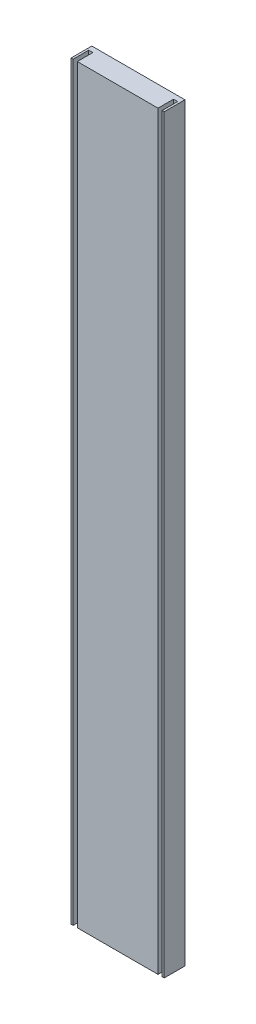
ISO-10303-21;
HEADER;
FILE_DESCRIPTION(('STEP AP214'),'2;1');
FILE_NAME('part.step','',(''),(''),'','','');
FILE_SCHEMA(('AUTOMOTIVE_DESIGN { 1 0 10303 214 1 1 1 1 }'));
ENDSEC;
DATA;
#1=APPLICATION_CONTEXT('core data for automotive mechanical design processes');
#2=APPLICATION_PROTOCOL_DEFINITION('international standard','automotive_design',2000,#1);
#3=PRODUCT_CONTEXT('',#1,'mechanical');
#4=PRODUCT('Part','Part','',(#3));
#5=PRODUCT_RELATED_PRODUCT_CATEGORY('part','',(#4));
#6=PRODUCT_DEFINITION_FORMATION('','',#4);
#7=PRODUCT_DEFINITION_CONTEXT('part definition',#1,'design');
#8=PRODUCT_DEFINITION('design','',#6,#7);
#9=PRODUCT_DEFINITION_SHAPE('','',#8);
#10=(LENGTH_UNIT() NAMED_UNIT(*) SI_UNIT(.MILLI.,.METRE.));
#11=(NAMED_UNIT(*) PLANE_ANGLE_UNIT() SI_UNIT($,.RADIAN.));
#12=(NAMED_UNIT(*) SI_UNIT($,.STERADIAN.) SOLID_ANGLE_UNIT());
#13=UNCERTAINTY_MEASURE_WITH_UNIT(LENGTH_MEASURE(1.E-05),#10,'distance_accuracy_value','');
#14=(GEOMETRIC_REPRESENTATION_CONTEXT(3) GLOBAL_UNCERTAINTY_ASSIGNED_CONTEXT((#13)) GLOBAL_UNIT_ASSIGNED_CONTEXT((#10,
#11,#12)) REPRESENTATION_CONTEXT('',''));
#15=CARTESIAN_POINT('',(0.,0.,0.));
#16=DIRECTION('',(0.,0.,1.));
#17=DIRECTION('',(1.,0.,0.));
#18=AXIS2_PLACEMENT_3D('',#15,#16,#17);
#19=CARTESIAN_POINT('',(-25.3651603859738,-675.,7.24108658743632));
#20=DIRECTION('',(0.,-1.,0.));
#21=DIRECTION('',(-1.,0.,0.));
#22=AXIS2_PLACEMENT_3D('',#19,#20,#21);
#23=PLANE('',#22);
#24=DIRECTION('',(0.,0.,1.));
#25=VECTOR('',#24,1.);
#26=CARTESIAN_POINT('',(-33.616298811545,-675.,-12.7589134125637));
#27=LINE('',#26,#25);
#28=CARTESIAN_POINT('',(-33.616298811545,-675.,-12.7589134125637));
#29=VERTEX_POINT('',#28);
#30=CARTESIAN_POINT('',(-33.616298811545,-675.,7.24108658743634));
#31=VERTEX_POINT('',#30);
#32=EDGE_CURVE('E40',#29,#31,#27,.T.);
#33=ORIENTED_EDGE('',*,*,#32,.F.);
#34=DIRECTION('',(-1.,0.,0.));
#35=VECTOR('',#34,1.);
#36=CARTESIAN_POINT('',(-33.616298811545,-675.,-12.7589134125637));
#37=LINE('',#36,#35);
#38=CARTESIAN_POINT('',(56.383701188455,-675.,-12.7589134125637));
#39=VERTEX_POINT('',#38);
#40=EDGE_CURVE('E120',#39,#29,#37,.T.);
#41=ORIENTED_EDGE('',*,*,#40,.F.);
#42=DIRECTION('',(0.,0.,-1.));
#43=VECTOR('',#42,1.);
#44=CARTESIAN_POINT('',(56.383701188455,-675.,-12.7589134125637));
#45=LINE('',#44,#43);
#46=CARTESIAN_POINT('',(56.383701188455,-675.,7.24108658743634));
#47=VERTEX_POINT('',#46);
#48=EDGE_CURVE('E124',#47,#39,#45,.T.);
#49=ORIENTED_EDGE('',*,*,#48,.F.);
#50=DIRECTION('',(1.,0.,0.));
#51=VECTOR('',#50,1.);
#52=CARTESIAN_POINT('',(54.383701188455,-675.,7.24108658743634));
#53=LINE('',#52,#51);
#54=CARTESIAN_POINT('',(54.383701188455,-675.,7.24108658743634));
#55=VERTEX_POINT('',#54);
#56=EDGE_CURVE('E128',#55,#47,#53,.T.);
#57=ORIENTED_EDGE('',*,*,#56,.F.);
#58=DIRECTION('',(0.,0.,1.));
#59=VECTOR('',#58,1.);
#60=CARTESIAN_POINT('',(54.383701188455,-675.,7.24108658743634));
#61=LINE('',#60,#59);
#62=CARTESIAN_POINT('',(54.383701188455,-675.,-7.75891341256366));
#63=VERTEX_POINT('',#62);
#64=EDGE_CURVE('E132',#63,#55,#61,.T.);
#65=ORIENTED_EDGE('',*,*,#64,.F.);
#66=DIRECTION('',(1.,0.,0.));
#67=VECTOR('',#66,1.);
#68=CARTESIAN_POINT('',(54.383701188455,-675.,-7.75891341256366));
#69=LINE('',#68,#67);
#70=CARTESIAN_POINT('',(50.383701188455,-675.,-7.75891341256366));
#71=VERTEX_POINT('',#70);
#72=EDGE_CURVE('E136',#71,#63,#69,.T.);
#73=ORIENTED_EDGE('',*,*,#72,.F.);
#74=DIRECTION('',(0.,0.,-1.));
#75=VECTOR('',#74,1.);
#76=CARTESIAN_POINT('',(50.383701188455,-675.,-7.75891341256366));
#77=LINE('',#76,#75);
#78=CARTESIAN_POINT('',(50.383701188455,-675.,7.24108658743633));
#79=VERTEX_POINT('',#78);
#80=EDGE_CURVE('E140',#79,#71,#77,.T.);
#81=ORIENTED_EDGE('',*,*,#80,.F.);
#82=DIRECTION('',(1.,0.,0.));
#83=VECTOR('',#82,1.);
#84=CARTESIAN_POINT('',(-27.616298811545,-675.,7.24108658743634));
#85=LINE('',#84,#83);
#86=CARTESIAN_POINT('',(-27.616298811545,-675.,7.24108658743634));
#87=VERTEX_POINT('',#86);
#88=EDGE_CURVE('E91',#87,#79,#85,.T.);
#89=ORIENTED_EDGE('',*,*,#88,.F.);
#90=DIRECTION('',(0.,0.,1.));
#91=VECTOR('',#90,1.);
#92=CARTESIAN_POINT('',(-27.616298811545,-675.,-7.75891341256366));
#93=LINE('',#92,#91);
#94=CARTESIAN_POINT('',(-27.616298811545,-675.,-7.75891341256366));
#95=VERTEX_POINT('',#94);
#96=EDGE_CURVE('E85',#95,#87,#93,.T.);
#97=ORIENTED_EDGE('',*,*,#96,.F.);
#98=DIRECTION('',(1.,0.,0.));
#99=VECTOR('',#98,1.);
#100=CARTESIAN_POINT('',(-31.616298811545,-675.,-7.75891341256366));
#101=LINE('',#100,#99);
#102=CARTESIAN_POINT('',(-31.616298811545,-675.,-7.75891341256366));
#103=VERTEX_POINT('',#102);
#104=EDGE_CURVE('E88',#103,#95,#101,.T.);
#105=ORIENTED_EDGE('',*,*,#104,.F.);
#106=DIRECTION('',(0.,0.,-1.));
#107=VECTOR('',#106,1.);
#108=CARTESIAN_POINT('',(-31.616298811545,-675.,7.24108658743634));
#109=LINE('',#108,#107);
#110=CARTESIAN_POINT('',(-31.616298811545,-675.,7.24108658743634));
#111=VERTEX_POINT('',#110);
#112=EDGE_CURVE('E53',#111,#103,#109,.T.);
#113=ORIENTED_EDGE('',*,*,#112,.F.);
#114=DIRECTION('',(1.,0.,0.));
#115=VECTOR('',#114,1.);
#116=CARTESIAN_POINT('',(-33.616298811545,-675.,7.24108658743634));
#117=LINE('',#116,#115);
#118=EDGE_CURVE('E47',#31,#111,#117,.T.);
#119=ORIENTED_EDGE('',*,*,#118,.F.);
#120=EDGE_LOOP('',(#33,#41,#49,#57,#65,#73,#81,#89,#97,#105,#113,#119));
#121=FACE_BOUND('',#120,.T.);
#122=ADVANCED_FACE('F33',(#121),#23,.T.);
#123=CARTESIAN_POINT('',(-33.616298811545,-767.195444572929,7.24108658743634));
#124=DIRECTION('',(0.,0.,1.));
#125=DIRECTION('',(1.,0.,0.));
#126=AXIS2_PLACEMENT_3D('',#123,#124,#125);
#127=PLANE('',#126);
#128=DIRECTION('',(0.,1.,0.));
#129=VECTOR('',#128,1.);
#130=CARTESIAN_POINT('',(-33.616298811545,-767.195444572929,7.24108658743634));
#131=LINE('',#130,#129);
#132=CARTESIAN_POINT('',(-33.616298811545,50.,7.24108658743634));
#133=VERTEX_POINT('',#132);
#134=EDGE_CURVE('E11',#31,#133,#131,.T.);
#135=ORIENTED_EDGE('',*,*,#134,.F.);
#136=ORIENTED_EDGE('',*,*,#118,.T.);
#137=DIRECTION('',(0.,1.,0.));
#138=VECTOR('',#137,1.);
#139=CARTESIAN_POINT('',(-31.616298811545,-767.195444572929,7.24108658743634));
#140=LINE('',#139,#138);
#141=CARTESIAN_POINT('',(-31.616298811545,50.,7.24108658743634));
#142=VERTEX_POINT('',#141);
#143=EDGE_CURVE('E116',#111,#142,#140,.T.);
#144=ORIENTED_EDGE('',*,*,#143,.T.);
#145=DIRECTION('',(1.,0.,0.));
#146=VECTOR('',#145,1.);
#147=CARTESIAN_POINT('',(-33.616298811545,50.,7.24108658743634));
#148=LINE('',#147,#146);
#149=EDGE_CURVE('E218',#133,#142,#148,.T.);
#150=ORIENTED_EDGE('',*,*,#149,.F.);
#151=EDGE_LOOP('',(#135,#136,#144,#150));
#152=FACE_BOUND('',#151,.T.);
#153=ADVANCED_FACE('F260',(#152),#127,.T.);
#154=CARTESIAN_POINT('',(-31.616298811545,-767.195444572929,7.24108658743634));
#155=DIRECTION('',(1.,0.,0.));
#156=DIRECTION('',(0.,0.,-1.));
#157=AXIS2_PLACEMENT_3D('',#154,#155,#156);
#158=PLANE('',#157);
#159=ORIENTED_EDGE('',*,*,#143,.F.);
#160=ORIENTED_EDGE('',*,*,#112,.T.);
#161=DIRECTION('',(0.,1.,0.));
#162=VECTOR('',#161,1.);
#163=CARTESIAN_POINT('',(-31.616298811545,-767.195444572929,-7.75891341256366));
#164=LINE('',#163,#162);
#165=CARTESIAN_POINT('',(-31.616298811545,50.,-7.75891341256366));
#166=VERTEX_POINT('',#165);
#167=EDGE_CURVE('E110',#103,#166,#164,.T.);
#168=ORIENTED_EDGE('',*,*,#167,.T.);
#169=DIRECTION('',(0.,0.,-1.));
#170=VECTOR('',#169,1.);
#171=CARTESIAN_POINT('',(-31.616298811545,50.,7.24108658743634));
#172=LINE('',#171,#170);
#173=EDGE_CURVE('E188',#142,#166,#172,.T.);
#174=ORIENTED_EDGE('',*,*,#173,.F.);
#175=EDGE_LOOP('',(#159,#160,#168,#174));
#176=FACE_BOUND('',#175,.T.);
#177=ADVANCED_FACE('F225',(#176),#158,.T.);
#178=CARTESIAN_POINT('',(-31.616298811545,-767.195444572929,-7.75891341256366));
#179=DIRECTION('',(0.,0.,1.));
#180=DIRECTION('',(1.,0.,0.));
#181=AXIS2_PLACEMENT_3D('',#178,#179,#180);
#182=PLANE('',#181);
#183=ORIENTED_EDGE('',*,*,#167,.F.);
#184=ORIENTED_EDGE('',*,*,#104,.T.);
#185=DIRECTION('',(0.,1.,0.));
#186=VECTOR('',#185,1.);
#187=CARTESIAN_POINT('',(-27.616298811545,-767.195444572929,-7.75891341256366));
#188=LINE('',#187,#186);
#189=CARTESIAN_POINT('',(-27.616298811545,50.,-7.75891341256366));
#190=VERTEX_POINT('',#189);
#191=EDGE_CURVE('E96',#95,#190,#188,.T.);
#192=ORIENTED_EDGE('',*,*,#191,.T.);
#193=DIRECTION('',(1.,0.,0.));
#194=VECTOR('',#193,1.);
#195=CARTESIAN_POINT('',(-31.616298811545,50.,-7.75891341256366));
#196=LINE('',#195,#194);
#197=EDGE_CURVE('E184',#166,#190,#196,.T.);
#198=ORIENTED_EDGE('',*,*,#197,.F.);
#199=EDGE_LOOP('',(#183,#184,#192,#198));
#200=FACE_BOUND('',#199,.T.);
#201=ADVANCED_FACE('F108',(#200),#182,.T.);
#202=CARTESIAN_POINT('',(-27.616298811545,-767.195444572929,-7.75891341256366));
#203=DIRECTION('',(-1.,0.,0.));
#204=DIRECTION('',(0.,0.,1.));
#205=AXIS2_PLACEMENT_3D('',#202,#203,#204);
#206=PLANE('',#205);
#207=ORIENTED_EDGE('',*,*,#191,.F.);
#208=ORIENTED_EDGE('',*,*,#96,.T.);
#209=DIRECTION('',(0.,1.,0.));
#210=VECTOR('',#209,1.);
#211=CARTESIAN_POINT('',(-27.616298811545,-767.195444572929,7.24108658743634));
#212=LINE('',#211,#210);
#213=CARTESIAN_POINT('',(-27.616298811545,50.,7.24108658743634));
#214=VERTEX_POINT('',#213);
#215=EDGE_CURVE('E95',#87,#214,#212,.T.);
#216=ORIENTED_EDGE('',*,*,#215,.T.);
#217=DIRECTION('',(0.,0.,1.));
#218=VECTOR('',#217,1.);
#219=CARTESIAN_POINT('',(-27.616298811545,50.,-7.75891341256366));
#220=LINE('',#219,#218);
#221=EDGE_CURVE('E103',#190,#214,#220,.T.);
#222=ORIENTED_EDGE('',*,*,#221,.F.);
#223=EDGE_LOOP('',(#207,#208,#216,#222));
#224=FACE_BOUND('',#223,.T.);
#225=ADVANCED_FACE('F100',(#224),#206,.T.);
#226=CARTESIAN_POINT('',(-27.616298811545,-767.195444572929,7.24108658743634));
#227=DIRECTION('',(0.,0.,1.));
#228=DIRECTION('',(1.,0.,0.));
#229=AXIS2_PLACEMENT_3D('',#226,#227,#228);
#230=PLANE('',#229);
#231=ORIENTED_EDGE('',*,*,#215,.F.);
#232=ORIENTED_EDGE('',*,*,#88,.T.);
#233=DIRECTION('',(0.,1.,0.));
#234=VECTOR('',#233,1.);
#235=CARTESIAN_POINT('',(50.383701188455,-767.195444572929,7.24108658743633));
#236=LINE('',#235,#234);
#237=CARTESIAN_POINT('',(50.383701188455,50.,7.24108658743633));
#238=VERTEX_POINT('',#237);
#239=EDGE_CURVE('E141',#79,#238,#236,.T.);
#240=ORIENTED_EDGE('',*,*,#239,.T.);
#241=DIRECTION('',(1.,0.,0.));
#242=VECTOR('',#241,1.);
#243=CARTESIAN_POINT('',(-27.616298811545,50.,7.24108658743634));
#244=LINE('',#243,#242);
#245=EDGE_CURVE('E176',#214,#238,#244,.T.);
#246=ORIENTED_EDGE('',*,*,#245,.F.);
#247=EDGE_LOOP('',(#231,#232,#240,#246));
#248=FACE_BOUND('',#247,.T.);
#249=ADVANCED_FACE('F170',(#248),#230,.T.);
#250=CARTESIAN_POINT('',(50.383701188455,-767.195444572929,-7.75891341256366));
#251=DIRECTION('',(1.,0.,0.));
#252=DIRECTION('',(0.,0.,-1.));
#253=AXIS2_PLACEMENT_3D('',#250,#251,#252);
#254=PLANE('',#253);
#255=ORIENTED_EDGE('',*,*,#239,.F.);
#256=ORIENTED_EDGE('',*,*,#80,.T.);
#257=DIRECTION('',(0.,1.,0.));
#258=VECTOR('',#257,1.);
#259=CARTESIAN_POINT('',(50.383701188455,-767.195444572929,-7.75891341256366));
#260=LINE('',#259,#258);
#261=CARTESIAN_POINT('',(50.383701188455,50.,-7.75891341256366));
#262=VERTEX_POINT('',#261);
#263=EDGE_CURVE('E137',#71,#262,#260,.T.);
#264=ORIENTED_EDGE('',*,*,#263,.T.);
#265=DIRECTION('',(0.,0.,-1.));
#266=VECTOR('',#265,1.);
#267=CARTESIAN_POINT('',(50.383701188455,50.,-7.75891341256366));
#268=LINE('',#267,#266);
#269=EDGE_CURVE('E186',#238,#262,#268,.T.);
#270=ORIENTED_EDGE('',*,*,#269,.F.);
#271=EDGE_LOOP('',(#255,#256,#264,#270));
#272=FACE_BOUND('',#271,.T.);
#273=ADVANCED_FACE('F250',(#272),#254,.T.);
#274=CARTESIAN_POINT('',(54.383701188455,-767.195444572929,-7.75891341256366));
#275=DIRECTION('',(0.,0.,1.));
#276=DIRECTION('',(1.,0.,0.));
#277=AXIS2_PLACEMENT_3D('',#274,#275,#276);
#278=PLANE('',#277);
#279=ORIENTED_EDGE('',*,*,#263,.F.);
#280=ORIENTED_EDGE('',*,*,#72,.T.);
#281=DIRECTION('',(0.,1.,0.));
#282=VECTOR('',#281,1.);
#283=CARTESIAN_POINT('',(54.383701188455,-767.195444572929,-7.75891341256366));
#284=LINE('',#283,#282);
#285=CARTESIAN_POINT('',(54.383701188455,50.,-7.75891341256366));
#286=VERTEX_POINT('',#285);
#287=EDGE_CURVE('E133',#63,#286,#284,.T.);
#288=ORIENTED_EDGE('',*,*,#287,.T.);
#289=DIRECTION('',(1.,0.,0.));
#290=VECTOR('',#289,1.);
#291=CARTESIAN_POINT('',(54.383701188455,50.,-7.75891341256366));
#292=LINE('',#291,#290);
#293=EDGE_CURVE('E193',#262,#286,#292,.T.);
#294=ORIENTED_EDGE('',*,*,#293,.F.);
#295=EDGE_LOOP('',(#279,#280,#288,#294));
#296=FACE_BOUND('',#295,.T.);
#297=ADVANCED_FACE('F248',(#296),#278,.T.);
#298=CARTESIAN_POINT('',(54.383701188455,-767.195444572929,7.24108658743634));
#299=DIRECTION('',(-1.,0.,0.));
#300=DIRECTION('',(0.,0.,1.));
#301=AXIS2_PLACEMENT_3D('',#298,#299,#300);
#302=PLANE('',#301);
#303=ORIENTED_EDGE('',*,*,#287,.F.);
#304=ORIENTED_EDGE('',*,*,#64,.T.);
#305=DIRECTION('',(0.,1.,0.));
#306=VECTOR('',#305,1.);
#307=CARTESIAN_POINT('',(54.383701188455,-767.195444572929,7.24108658743634));
#308=LINE('',#307,#306);
#309=CARTESIAN_POINT('',(54.383701188455,50.,7.24108658743634));
#310=VERTEX_POINT('',#309);
#311=EDGE_CURVE('E129',#55,#310,#308,.T.);
#312=ORIENTED_EDGE('',*,*,#311,.T.);
#313=DIRECTION('',(0.,0.,1.));
#314=VECTOR('',#313,1.);
#315=CARTESIAN_POINT('',(54.383701188455,50.,7.24108658743634));
#316=LINE('',#315,#314);
#317=EDGE_CURVE('E196',#286,#310,#316,.T.);
#318=ORIENTED_EDGE('',*,*,#317,.F.);
#319=EDGE_LOOP('',(#303,#304,#312,#318));
#320=FACE_BOUND('',#319,.T.);
#321=ADVANCED_FACE('F244',(#320),#302,.T.);
#322=CARTESIAN_POINT('',(54.383701188455,-767.195444572929,7.24108658743634));
#323=DIRECTION('',(0.,0.,1.));
#324=DIRECTION('',(1.,0.,0.));
#325=AXIS2_PLACEMENT_3D('',#322,#323,#324);
#326=PLANE('',#325);
#327=ORIENTED_EDGE('',*,*,#311,.F.);
#328=ORIENTED_EDGE('',*,*,#56,.T.);
#329=DIRECTION('',(0.,1.,0.));
#330=VECTOR('',#329,1.);
#331=CARTESIAN_POINT('',(56.383701188455,-767.195444572929,7.24108658743634));
#332=LINE('',#331,#330);
#333=CARTESIAN_POINT('',(56.383701188455,50.,7.24108658743634));
#334=VERTEX_POINT('',#333);
#335=EDGE_CURVE('E125',#47,#334,#332,.T.);
#336=ORIENTED_EDGE('',*,*,#335,.T.);
#337=DIRECTION('',(1.,0.,0.));
#338=VECTOR('',#337,1.);
#339=CARTESIAN_POINT('',(54.383701188455,50.,7.24108658743634));
#340=LINE('',#339,#338);
#341=EDGE_CURVE('E199',#310,#334,#340,.T.);
#342=ORIENTED_EDGE('',*,*,#341,.F.);
#343=EDGE_LOOP('',(#327,#328,#336,#342));
#344=FACE_BOUND('',#343,.T.);
#345=ADVANCED_FACE('F239',(#344),#326,.T.);
#346=CARTESIAN_POINT('',(56.383701188455,-767.195444572929,-12.7589134125637));
#347=DIRECTION('',(1.,0.,0.));
#348=DIRECTION('',(0.,0.,-1.));
#349=AXIS2_PLACEMENT_3D('',#346,#347,#348);
#350=PLANE('',#349);
#351=ORIENTED_EDGE('',*,*,#335,.F.);
#352=ORIENTED_EDGE('',*,*,#48,.T.);
#353=DIRECTION('',(0.,1.,0.));
#354=VECTOR('',#353,1.);
#355=CARTESIAN_POINT('',(56.383701188455,-767.195444572929,-12.7589134125637));
#356=LINE('',#355,#354);
#357=CARTESIAN_POINT('',(56.383701188455,50.,-12.7589134125637));
#358=VERTEX_POINT('',#357);
#359=EDGE_CURVE('E121',#39,#358,#356,.T.);
#360=ORIENTED_EDGE('',*,*,#359,.T.);
#361=DIRECTION('',(0.,0.,-1.));
#362=VECTOR('',#361,1.);
#363=CARTESIAN_POINT('',(56.383701188455,50.,-12.7589134125637));
#364=LINE('',#363,#362);
#365=EDGE_CURVE('E153',#334,#358,#364,.T.);
#366=ORIENTED_EDGE('',*,*,#365,.F.);
#367=EDGE_LOOP('',(#351,#352,#360,#366));
#368=FACE_BOUND('',#367,.T.);
#369=ADVANCED_FACE('F240',(#368),#350,.T.);
#370=CARTESIAN_POINT('',(-33.616298811545,-767.195444572929,-12.7589134125637));
#371=DIRECTION('',(0.,0.,-1.));
#372=DIRECTION('',(-1.,0.,0.));
#373=AXIS2_PLACEMENT_3D('',#370,#371,#372);
#374=PLANE('',#373);
#375=ORIENTED_EDGE('',*,*,#359,.F.);
#376=ORIENTED_EDGE('',*,*,#40,.T.);
#377=DIRECTION('',(0.,1.,0.));
#378=VECTOR('',#377,1.);
#379=CARTESIAN_POINT('',(-33.616298811545,-767.195444572929,-12.7589134125637));
#380=LINE('',#379,#378);
#381=CARTESIAN_POINT('',(-33.616298811545,50.,-12.7589134125637));
#382=VERTEX_POINT('',#381);
#383=EDGE_CURVE('E117',#29,#382,#380,.T.);
#384=ORIENTED_EDGE('',*,*,#383,.T.);
#385=DIRECTION('',(-1.,0.,0.));
#386=VECTOR('',#385,1.);
#387=CARTESIAN_POINT('',(-33.616298811545,50.,-12.7589134125637));
#388=LINE('',#387,#386);
#389=EDGE_CURVE('E149',#358,#382,#388,.T.);
#390=ORIENTED_EDGE('',*,*,#389,.F.);
#391=EDGE_LOOP('',(#375,#376,#384,#390));
#392=FACE_BOUND('',#391,.T.);
#393=ADVANCED_FACE('F212',(#392),#374,.T.);
#394=CARTESIAN_POINT('',(-33.616298811545,-767.195444572929,-12.7589134125637));
#395=DIRECTION('',(-1.,0.,0.));
#396=DIRECTION('',(0.,0.,1.));
#397=AXIS2_PLACEMENT_3D('',#394,#395,#396);
#398=PLANE('',#397);
#399=ORIENTED_EDGE('',*,*,#383,.F.);
#400=ORIENTED_EDGE('',*,*,#32,.T.);
#401=ORIENTED_EDGE('',*,*,#134,.T.);
#402=DIRECTION('',(0.,0.,1.));
#403=VECTOR('',#402,1.);
#404=CARTESIAN_POINT('',(-33.616298811545,50.,-12.7589134125637));
#405=LINE('',#404,#403);
#406=EDGE_CURVE('E216',#382,#133,#405,.T.);
#407=ORIENTED_EDGE('',*,*,#406,.F.);
#408=EDGE_LOOP('',(#399,#400,#401,#407));
#409=FACE_BOUND('',#408,.T.);
#410=ADVANCED_FACE('F215',(#409),#398,.T.);
#411=CARTESIAN_POINT('',(0.,50.,0.));
#412=DIRECTION('',(0.,1.,0.));
#413=DIRECTION('',(0.,0.,1.));
#414=AXIS2_PLACEMENT_3D('',#411,#412,#413);
#415=PLANE('',#414);
#416=ORIENTED_EDGE('',*,*,#406,.T.);
#417=ORIENTED_EDGE('',*,*,#149,.T.);
#418=ORIENTED_EDGE('',*,*,#173,.T.);
#419=ORIENTED_EDGE('',*,*,#197,.T.);
#420=ORIENTED_EDGE('',*,*,#221,.T.);
#421=ORIENTED_EDGE('',*,*,#245,.T.);
#422=ORIENTED_EDGE('',*,*,#269,.T.);
#423=ORIENTED_EDGE('',*,*,#293,.T.);
#424=ORIENTED_EDGE('',*,*,#317,.T.);
#425=ORIENTED_EDGE('',*,*,#341,.T.);
#426=ORIENTED_EDGE('',*,*,#365,.T.);
#427=ORIENTED_EDGE('',*,*,#389,.T.);
#428=EDGE_LOOP('',(#416,#417,#418,#419,#420,#421,#422,#423,#424,#425,#426,#427));
#429=FACE_BOUND('',#428,.T.);
#430=ADVANCED_FACE('F180',(#429),#415,.T.);
#431=CLOSED_SHELL('',(#122,#153,#177,#201,#225,#249,#273,#297,#321,#345,#369,#393,#410,#430));
#432=MANIFOLD_SOLID_BREP('B2',#431);
#433=ADVANCED_BREP_SHAPE_REPRESENTATION('',(#18,#432),#14);
#434=SHAPE_DEFINITION_REPRESENTATION(#9,#433);
ENDSEC;
END-ISO-10303-21;
